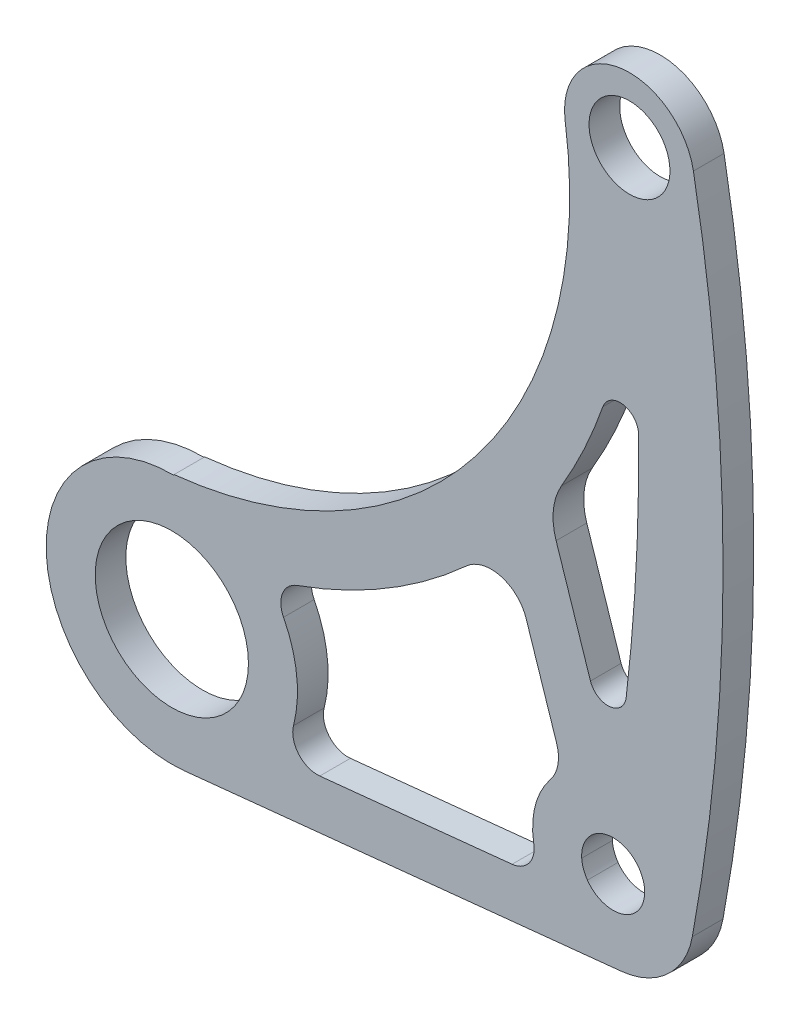
ISO-10303-21;
HEADER;
FILE_DESCRIPTION(('STEP AP214'),'2;1');
FILE_NAME('part.step','',(''),(''),'','','');
FILE_SCHEMA(('AUTOMOTIVE_DESIGN { 1 0 10303 214 1 1 1 1 }'));
ENDSEC;
DATA;
#1=APPLICATION_CONTEXT('core data for automotive mechanical design processes');
#2=APPLICATION_PROTOCOL_DEFINITION('international standard','automotive_design',2000,#1);
#3=PRODUCT_CONTEXT('',#1,'mechanical');
#4=PRODUCT('Part','Part','',(#3));
#5=PRODUCT_RELATED_PRODUCT_CATEGORY('part','',(#4));
#6=PRODUCT_DEFINITION_FORMATION('','',#4);
#7=PRODUCT_DEFINITION_CONTEXT('part definition',#1,'design');
#8=PRODUCT_DEFINITION('design','',#6,#7);
#9=PRODUCT_DEFINITION_SHAPE('','',#8);
#10=(LENGTH_UNIT() NAMED_UNIT(*) SI_UNIT(.MILLI.,.METRE.));
#11=(NAMED_UNIT(*) PLANE_ANGLE_UNIT() SI_UNIT($,.RADIAN.));
#12=(NAMED_UNIT(*) SI_UNIT($,.STERADIAN.) SOLID_ANGLE_UNIT());
#13=UNCERTAINTY_MEASURE_WITH_UNIT(LENGTH_MEASURE(1.E-05),#10,'distance_accuracy_value','');
#14=(GEOMETRIC_REPRESENTATION_CONTEXT(3) GLOBAL_UNCERTAINTY_ASSIGNED_CONTEXT((#13)) GLOBAL_UNIT_ASSIGNED_CONTEXT((#10,
#11,#12)) REPRESENTATION_CONTEXT('',''));
#15=CARTESIAN_POINT('',(0.,0.,0.));
#16=DIRECTION('',(0.,0.,1.));
#17=DIRECTION('',(1.,0.,0.));
#18=AXIS2_PLACEMENT_3D('',#15,#16,#17);
#19=CARTESIAN_POINT('',(45.72,0.,3.175));
#20=DIRECTION('',(0.,0.,-1.));
#21=DIRECTION('',(-1.,0.,0.));
#22=AXIS2_PLACEMENT_3D('',#19,#20,#21);
#23=CYLINDRICAL_SURFACE('',#22,3.2639);
#24=CARTESIAN_POINT('',(45.72,0.,0.));
#25=DIRECTION('',(0.,0.,1.));
#26=DIRECTION('',(1.,0.,0.));
#27=AXIS2_PLACEMENT_3D('',#24,#25,#26);
#28=CIRCLE('',#27,3.2639);
#29=CARTESIAN_POINT('',(42.4625763798194,-0.205510507492002,0.));
#30=VERTEX_POINT('',#29);
#31=CARTESIAN_POINT('',(43.0519360241002,-1.88002069948861,0.));
#32=VERTEX_POINT('',#31);
#33=EDGE_CURVE('E416',#30,#32,#28,.T.);
#34=ORIENTED_EDGE('',*,*,#33,.F.);
#35=DIRECTION('',(0.,0.,1.));
#36=VECTOR('',#35,1.);
#37=CARTESIAN_POINT('',(42.4625763798194,-0.205510507492002,3.175));
#38=LINE('',#37,#36);
#39=CARTESIAN_POINT('',(42.4625763798194,-0.205510507492002,3.175));
#40=VERTEX_POINT('',#39);
#41=EDGE_CURVE('E265',#30,#40,#38,.T.);
#42=ORIENTED_EDGE('',*,*,#41,.T.);
#43=CARTESIAN_POINT('',(45.72,0.,3.175));
#44=DIRECTION('',(0.,0.,1.));
#45=DIRECTION('',(1.,0.,0.));
#46=AXIS2_PLACEMENT_3D('',#43,#44,#45);
#47=CIRCLE('',#46,3.2639);
#48=CARTESIAN_POINT('',(43.0519360241002,-1.88002069948861,3.175));
#49=VERTEX_POINT('',#48);
#50=EDGE_CURVE('E444',#40,#49,#47,.T.);
#51=ORIENTED_EDGE('',*,*,#50,.T.);
#52=DIRECTION('',(0.,0.,1.));
#53=VECTOR('',#52,1.);
#54=CARTESIAN_POINT('',(43.0519360241002,-1.88002069948861,3.175));
#55=LINE('',#54,#53);
#56=EDGE_CURVE('E249',#32,#49,#55,.T.);
#57=ORIENTED_EDGE('',*,*,#56,.F.);
#58=EDGE_LOOP('',(#34,#42,#51,#57));
#59=FACE_BOUND('',#58,.T.);
#60=ADVANCED_FACE('F47',(#59),#23,.F.);
#61=CARTESIAN_POINT('',(48.9774236201806,0.205510507492002,3.175));
#62=VERTEX_POINT('',#61);
#63=EDGE_CURVE('E438',#49,#62,#47,.T.);
#64=ORIENTED_EDGE('',*,*,#63,.T.);
#65=DIRECTION('',(0.,0.,-1.));
#66=VECTOR('',#65,1.);
#67=CARTESIAN_POINT('',(48.9774236201806,0.205510507492002,3.175));
#68=LINE('',#67,#66);
#69=CARTESIAN_POINT('',(48.9774236201806,0.205510507492002,0.));
#70=VERTEX_POINT('',#69);
#71=EDGE_CURVE('E262',#62,#70,#68,.T.);
#72=ORIENTED_EDGE('',*,*,#71,.T.);
#73=EDGE_CURVE('E417',#32,#70,#28,.T.);
#74=ORIENTED_EDGE('',*,*,#73,.F.);
#75=ORIENTED_EDGE('',*,*,#56,.T.);
#76=EDGE_LOOP('',(#64,#72,#74,#75));
#77=FACE_BOUND('',#76,.T.);
#78=ADVANCED_FACE('F503',(#77),#23,.F.);
#79=ORIENTED_EDGE('',*,*,#71,.F.);
#80=CARTESIAN_POINT('',(48.3880639758998,1.88002069948861,3.175));
#81=VERTEX_POINT('',#80);
#82=EDGE_CURVE('E442',#62,#81,#47,.T.);
#83=ORIENTED_EDGE('',*,*,#82,.T.);
#84=DIRECTION('',(0.,0.,-1.));
#85=VECTOR('',#84,1.);
#86=CARTESIAN_POINT('',(48.3880639758998,1.88002069948861,3.175));
#87=LINE('',#86,#85);
#88=CARTESIAN_POINT('',(48.3880639758998,1.88002069948861,0.));
#89=VERTEX_POINT('',#88);
#90=EDGE_CURVE('E253',#81,#89,#87,.T.);
#91=ORIENTED_EDGE('',*,*,#90,.T.);
#92=EDGE_CURVE('E419',#70,#89,#28,.T.);
#93=ORIENTED_EDGE('',*,*,#92,.F.);
#94=EDGE_LOOP('',(#79,#83,#91,#93));
#95=FACE_BOUND('',#94,.T.);
#96=ADVANCED_FACE('F493',(#95),#23,.F.);
#97=CARTESIAN_POINT('',(-142.138533342949,38.656045003802,3.175));
#98=DIRECTION('',(0.,0.,-1.));
#99=DIRECTION('',(-1.,0.,0.));
#100=AXIS2_PLACEMENT_3D('',#97,#98,#99);
#101=CYLINDRICAL_SURFACE('',#100,190.5);
#102=CARTESIAN_POINT('',(-142.138533342949,38.656045003802,0.));
#103=DIRECTION('',(0.,0.,1.));
#104=DIRECTION('',(1.,0.,0.));
#105=AXIS2_PLACEMENT_3D('',#102,#103,#104);
#106=CIRCLE('',#105,190.5);
#107=CARTESIAN_POINT('',(47.0702030784157,16.5132343910918,0.));
#108=VERTEX_POINT('',#107);
#109=CARTESIAN_POINT('',(48.3497321227549,40.7704526909221,0.));
#110=VERTEX_POINT('',#109);
#111=EDGE_CURVE('E356',#108,#110,#106,.T.);
#112=ORIENTED_EDGE('',*,*,#111,.F.);
#113=DIRECTION('',(0.,0.,-1.));
#114=VECTOR('',#113,1.);
#115=CARTESIAN_POINT('',(47.0702030784158,16.5132343910918,3.175));
#116=LINE('',#115,#114);
#117=CARTESIAN_POINT('',(47.0702030784157,16.5132343910918,3.175));
#118=VERTEX_POINT('',#117);
#119=EDGE_CURVE('E321',#108,#118,#116,.F.);
#120=ORIENTED_EDGE('',*,*,#119,.T.);
#121=CARTESIAN_POINT('',(-142.138533342949,38.656045003802,3.175));
#122=DIRECTION('',(0.,0.,1.));
#123=DIRECTION('',(1.,0.,0.));
#124=AXIS2_PLACEMENT_3D('',#121,#122,#123);
#125=CIRCLE('',#124,190.5);
#126=CARTESIAN_POINT('',(48.3497321227549,40.7704526909221,3.175));
#127=VERTEX_POINT('',#126);
#128=EDGE_CURVE('E436',#118,#127,#125,.T.);
#129=ORIENTED_EDGE('',*,*,#128,.T.);
#130=DIRECTION('',(0.,0.,-1.));
#131=VECTOR('',#130,1.);
#132=CARTESIAN_POINT('',(48.3497321227549,40.7704526909221,3.175));
#133=LINE('',#132,#131);
#134=EDGE_CURVE('E318',#127,#110,#133,.T.);
#135=ORIENTED_EDGE('',*,*,#134,.T.);
#136=EDGE_LOOP('',(#112,#120,#129,#135));
#137=FACE_BOUND('',#136,.T.);
#138=ADVANCED_FACE('F425',(#137),#101,.F.);
#139=CARTESIAN_POINT('',(43.9242602583384,14.4500573911322,3.175));
#140=DIRECTION('',(0.949917524329056,0.312500715155273,0.));
#141=DIRECTION('',(-0.312500715155273,0.949917524329056,0.));
#142=AXIS2_PLACEMENT_3D('',#139,#140,#141);
#143=PLANE('',#142);
#144=DIRECTION('',(0.312500715155273,-0.949917524329056,0.));
#145=VECTOR('',#144,1.);
#146=CARTESIAN_POINT('',(43.9242602583384,14.4500573911322,0.));
#147=LINE('',#146,#145);
#148=CARTESIAN_POINT('',(39.8116959434713,26.9511389028385,0.));
#149=VERTEX_POINT('',#148);
#150=CARTESIAN_POINT('',(43.3685228303553,16.1393486348481,0.));
#151=VERTEX_POINT('',#150);
#152=EDGE_CURVE('E352',#149,#151,#147,.T.);
#153=ORIENTED_EDGE('',*,*,#152,.F.);
#154=DIRECTION('',(0.,0.,-1.));
#155=VECTOR('',#154,1.);
#156=CARTESIAN_POINT('',(39.8116959434713,26.9511389028385,3.175));
#157=LINE('',#156,#155);
#158=CARTESIAN_POINT('',(39.8116959434713,26.9511389028385,3.175));
#159=VERTEX_POINT('',#158);
#160=EDGE_CURVE('E68',#149,#159,#157,.F.);
#161=ORIENTED_EDGE('',*,*,#160,.T.);
#162=DIRECTION('',(0.312500715155273,-0.949917524329056,0.));
#163=VECTOR('',#162,1.);
#164=CARTESIAN_POINT('',(43.9242602583384,14.4500573911322,3.175));
#165=LINE('',#164,#163);
#166=CARTESIAN_POINT('',(43.3685228303553,16.1393486348481,3.175));
#167=VERTEX_POINT('',#166);
#168=EDGE_CURVE('E435',#159,#167,#165,.T.);
#169=ORIENTED_EDGE('',*,*,#168,.T.);
#170=DIRECTION('',(0.,0.,1.));
#171=VECTOR('',#170,1.);
#172=CARTESIAN_POINT('',(43.3685228303553,16.1393486348481,0.));
#173=LINE('',#172,#171);
#174=EDGE_CURVE('E315',#167,#151,#173,.F.);
#175=ORIENTED_EDGE('',*,*,#174,.T.);
#176=EDGE_LOOP('',(#153,#161,#169,#175));
#177=FACE_BOUND('',#176,.T.);
#178=ADVANCED_FACE('F543',(#177),#143,.T.);
#179=CARTESIAN_POINT('',(0.811388888888889,-7.89592010604133,3.175));
#180=DIRECTION('',(-0.102222222222222,0.994761588162687,0.));
#181=DIRECTION('',(-0.994761588162687,-0.102222222222222,0.));
#182=AXIS2_PLACEMENT_3D('',#179,#180,#181);
#183=PLANE('',#182);
#184=DIRECTION('',(0.994761588162687,0.102222222222222,0.));
#185=VECTOR('',#184,1.);
#186=CARTESIAN_POINT('',(0.811388888888889,-7.89592010604133,0.));
#187=LINE('',#186,#185);
#188=CARTESIAN_POINT('',(15.3261433532772,-6.40437632910465,0.));
#189=VERTEX_POINT('',#188);
#190=CARTESIAN_POINT('',(35.2507315842154,-4.35691519865322,0.));
#191=VERTEX_POINT('',#190);
#192=EDGE_CURVE('E402',#189,#191,#187,.T.);
#193=ORIENTED_EDGE('',*,*,#192,.F.);
#194=DIRECTION('',(0.,0.,-1.));
#195=VECTOR('',#194,1.);
#196=CARTESIAN_POINT('',(15.3261433532772,-6.40437632910465,3.175));
#197=LINE('',#196,#195);
#198=CARTESIAN_POINT('',(15.3261433532772,-6.40437632910465,3.175));
#199=VERTEX_POINT('',#198);
#200=EDGE_CURVE('E276',#189,#199,#197,.F.);
#201=ORIENTED_EDGE('',*,*,#200,.T.);
#202=DIRECTION('',(0.994761588162687,0.102222222222222,0.));
#203=VECTOR('',#202,1.);
#204=CARTESIAN_POINT('',(0.811388888888889,-7.89592010604133,3.175));
#205=LINE('',#204,#203);
#206=CARTESIAN_POINT('',(35.2507315842154,-4.35691519865322,3.175));
#207=VERTEX_POINT('',#206);
#208=EDGE_CURVE('E473',#199,#207,#205,.T.);
#209=ORIENTED_EDGE('',*,*,#208,.T.);
#210=DIRECTION('',(0.,0.,-1.));
#211=VECTOR('',#210,1.);
#212=CARTESIAN_POINT('',(35.2507315842154,-4.35691519865322,3.175));
#213=LINE('',#212,#211);
#214=EDGE_CURVE('E273',#207,#191,#213,.T.);
#215=ORIENTED_EDGE('',*,*,#214,.T.);
#216=EDGE_LOOP('',(#193,#201,#209,#215));
#217=FACE_BOUND('',#216,.T.);
#218=ADVANCED_FACE('F549',(#217),#183,.T.);
#219=CARTESIAN_POINT('',(0.,0.,3.175));
#220=DIRECTION('',(0.,0.,-1.));
#221=DIRECTION('',(-1.,0.,0.));
#222=AXIS2_PLACEMENT_3D('',#219,#220,#221);
#223=CYLINDRICAL_SURFACE('',#222,13.0175);
#224=CARTESIAN_POINT('',(0.,0.,3.175));
#225=DIRECTION('',(0.,0.,1.));
#226=DIRECTION('',(1.,0.,0.));
#227=AXIS2_PLACEMENT_3D('',#224,#225,#226);
#228=CIRCLE('',#227,13.0175);
#229=CARTESIAN_POINT('',(12.6066623522887,-3.24459097351078,3.175));
#230=VERTEX_POINT('',#229);
#231=CARTESIAN_POINT('',(11.5722495603721,5.9614047306376,3.175));
#232=VERTEX_POINT('',#231);
#233=EDGE_CURVE('E476',#230,#232,#228,.T.);
#234=ORIENTED_EDGE('',*,*,#233,.F.);
#235=DIRECTION('',(0.,0.,-1.));
#236=VECTOR('',#235,1.);
#237=CARTESIAN_POINT('',(12.6066623522887,-3.24459097351078,3.175));
#238=LINE('',#237,#236);
#239=CARTESIAN_POINT('',(12.6066623522887,-3.24459097351078,0.));
#240=VERTEX_POINT('',#239);
#241=EDGE_CURVE('E270',#230,#240,#238,.T.);
#242=ORIENTED_EDGE('',*,*,#241,.T.);
#243=CARTESIAN_POINT('',(0.,0.,0.));
#244=DIRECTION('',(0.,0.,1.));
#245=DIRECTION('',(1.,0.,0.));
#246=AXIS2_PLACEMENT_3D('',#243,#244,#245);
#247=CIRCLE('',#246,13.0175);
#248=CARTESIAN_POINT('',(11.5722495603721,5.9614047306376,0.));
#249=VERTEX_POINT('',#248);
#250=EDGE_CURVE('E405',#240,#249,#247,.T.);
#251=ORIENTED_EDGE('',*,*,#250,.T.);
#252=DIRECTION('',(0.,0.,-1.));
#253=VECTOR('',#252,1.);
#254=CARTESIAN_POINT('',(11.5722495603721,5.9614047306376,3.175));
#255=LINE('',#254,#253);
#256=EDGE_CURVE('E268',#249,#232,#255,.F.);
#257=ORIENTED_EDGE('',*,*,#256,.T.);
#258=EDGE_LOOP('',(#234,#242,#251,#257));
#259=FACE_BOUND('',#258,.T.);
#260=ADVANCED_FACE('F807',(#259),#223,.T.);
#261=CARTESIAN_POINT('',(-4.50533240745612,58.5644592406378,3.175));
#262=DIRECTION('',(0.,0.,-1.));
#263=DIRECTION('',(-1.,0.,0.));
#264=AXIS2_PLACEMENT_3D('',#261,#262,#263);
#265=CYLINDRICAL_SURFACE('',#264,52.07);
#266=CARTESIAN_POINT('',(-4.50533240745612,58.5644592406378,0.));
#267=DIRECTION('',(0.,0.,1.));
#268=DIRECTION('',(1.,0.,0.));
#269=AXIS2_PLACEMENT_3D('',#266,#267,#268);
#270=CIRCLE('',#269,52.07);
#271=CARTESIAN_POINT('',(12.9774317126353,9.51715698331437,0.));
#272=VERTEX_POINT('',#271);
#273=CARTESIAN_POINT('',(30.5233562094004,20.0381581752188,0.));
#274=VERTEX_POINT('',#273);
#275=EDGE_CURVE('E408',#272,#274,#270,.T.);
#276=ORIENTED_EDGE('',*,*,#275,.T.);
#277=DIRECTION('',(0.,0.,-1.));
#278=VECTOR('',#277,1.);
#279=CARTESIAN_POINT('',(30.5233562094004,20.0381581752188,3.175));
#280=LINE('',#279,#278);
#281=CARTESIAN_POINT('',(30.5233562094004,20.0381581752188,3.175));
#282=VERTEX_POINT('',#281);
#283=EDGE_CURVE('E305',#274,#282,#280,.F.);
#284=ORIENTED_EDGE('',*,*,#283,.T.);
#285=CARTESIAN_POINT('',(-4.50533240745612,58.5644592406378,3.175));
#286=DIRECTION('',(0.,0.,1.));
#287=DIRECTION('',(1.,0.,0.));
#288=AXIS2_PLACEMENT_3D('',#285,#286,#287);
#289=CIRCLE('',#288,52.07);
#290=CARTESIAN_POINT('',(12.9774317126353,9.51715698331437,3.175));
#291=VERTEX_POINT('',#290);
#292=EDGE_CURVE('E479',#291,#282,#289,.T.);
#293=ORIENTED_EDGE('',*,*,#292,.F.);
#294=DIRECTION('',(0.,0.,-1.));
#295=VECTOR('',#294,1.);
#296=CARTESIAN_POINT('',(12.9774317126353,9.51715698331437,3.175));
#297=LINE('',#296,#295);
#298=EDGE_CURVE('E281',#291,#272,#297,.T.);
#299=ORIENTED_EDGE('',*,*,#298,.T.);
#300=EDGE_LOOP('',(#276,#284,#293,#299));
#301=FACE_BOUND('',#300,.T.);
#302=ADVANCED_FACE('F815',(#301),#265,.T.);
#303=CARTESIAN_POINT('',(38.586011370491,12.6938979852854,3.175));
#304=DIRECTION('',(0.949917524329056,0.312500715155272,0.));
#305=DIRECTION('',(-0.312500715155272,0.949917524329057,0.));
#306=AXIS2_PLACEMENT_3D('',#303,#304,#305);
#307=PLANE('',#306);
#308=DIRECTION('',(0.312500715155272,-0.949917524329057,0.));
#309=VECTOR('',#308,1.);
#310=CARTESIAN_POINT('',(38.586011370491,12.6938979852854,0.));
#311=LINE('',#310,#309);
#312=CARTESIAN_POINT('',(36.7056167539373,18.4097882610273,0.));
#313=VERTEX_POINT('',#312);
#314=CARTESIAN_POINT('',(39.8655919363517,8.80431967600672,0.));
#315=VERTEX_POINT('',#314);
#316=EDGE_CURVE('E411',#313,#315,#311,.T.);
#317=ORIENTED_EDGE('',*,*,#316,.T.);
#318=DIRECTION('',(0.,0.,1.));
#319=VECTOR('',#318,1.);
#320=CARTESIAN_POINT('',(39.8655919363517,8.80431967600672,3.175));
#321=LINE('',#320,#319);
#322=CARTESIAN_POINT('',(39.8655919363517,8.80431967600672,3.175));
#323=VERTEX_POINT('',#322);
#324=EDGE_CURVE('E303',#315,#323,#321,.T.);
#325=ORIENTED_EDGE('',*,*,#324,.T.);
#326=DIRECTION('',(0.312500715155272,-0.949917524329057,0.));
#327=VECTOR('',#326,1.);
#328=CARTESIAN_POINT('',(38.586011370491,12.6938979852854,3.175));
#329=LINE('',#328,#327);
#330=CARTESIAN_POINT('',(36.7056167539373,18.4097882610273,3.175));
#331=VERTEX_POINT('',#330);
#332=EDGE_CURVE('E482',#331,#323,#329,.T.);
#333=ORIENTED_EDGE('',*,*,#332,.F.);
#334=DIRECTION('',(0.,0.,1.));
#335=VECTOR('',#334,1.);
#336=CARTESIAN_POINT('',(36.7056167539373,18.4097882610273,0.));
#337=LINE('',#336,#335);
#338=EDGE_CURVE('E300',#331,#313,#337,.F.);
#339=ORIENTED_EDGE('',*,*,#338,.T.);
#340=EDGE_LOOP('',(#317,#325,#333,#339));
#341=FACE_BOUND('',#340,.T.);
#342=ADVANCED_FACE('F580',(#341),#307,.F.);
#343=CARTESIAN_POINT('',(45.72,0.,3.175));
#344=DIRECTION('',(0.,0.,-1.));
#345=DIRECTION('',(-1.,0.,0.));
#346=AXIS2_PLACEMENT_3D('',#343,#344,#345);
#347=CYLINDRICAL_SURFACE('',#346,8.3439);
#348=CARTESIAN_POINT('',(45.72,0.,0.));
#349=DIRECTION('',(0.,0.,1.));
#350=DIRECTION('',(1.,0.,0.));
#351=AXIS2_PLACEMENT_3D('',#348,#349,#350);
#352=CIRCLE('',#351,8.3439);
#353=CARTESIAN_POINT('',(46.572932,-8.30019121547064,0.));
#354=VERTEX_POINT('',#353);
#355=CARTESIAN_POINT('',(53.9245222927567,-1.51871036002841,0.));
#356=VERTEX_POINT('',#355);
#357=EDGE_CURVE('E248',#354,#356,#352,.T.);
#358=ORIENTED_EDGE('',*,*,#357,.T.);
#359=DIRECTION('',(0.,0.,-1.));
#360=VECTOR('',#359,1.);
#361=CARTESIAN_POINT('',(53.9245222927567,-1.51871036002841,3.175));
#362=LINE('',#361,#360);
#363=CARTESIAN_POINT('',(53.9245222927567,-1.51871036002841,3.175));
#364=VERTEX_POINT('',#363);
#365=EDGE_CURVE('E228',#364,#356,#362,.T.);
#366=ORIENTED_EDGE('',*,*,#365,.F.);
#367=CARTESIAN_POINT('',(45.72,0.,3.175));
#368=DIRECTION('',(0.,0.,1.));
#369=DIRECTION('',(1.,0.,0.));
#370=AXIS2_PLACEMENT_3D('',#367,#368,#369);
#371=CIRCLE('',#370,8.3439);
#372=CARTESIAN_POINT('',(46.572932,-8.30019121547064,3.175));
#373=VERTEX_POINT('',#372);
#374=EDGE_CURVE('E235',#373,#364,#371,.T.);
#375=ORIENTED_EDGE('',*,*,#374,.F.);
#376=DIRECTION('',(0.,0.,-1.));
#377=VECTOR('',#376,1.);
#378=CARTESIAN_POINT('',(46.572932,-8.30019121547064,3.175));
#379=LINE('',#378,#377);
#380=EDGE_CURVE('E362',#373,#354,#379,.T.);
#381=ORIENTED_EDGE('',*,*,#380,.T.);
#382=EDGE_LOOP('',(#358,#366,#375,#381));
#383=FACE_BOUND('',#382,.T.);
#384=ADVANCED_FACE('F246',(#383),#347,.T.);
#385=CARTESIAN_POINT('',(-133.393338272466,33.1550421520357,3.175));
#386=DIRECTION('',(0.,0.,-1.));
#387=DIRECTION('',(-1.,0.,0.));
#388=AXIS2_PLACEMENT_3D('',#385,#386,#387);
#389=CYLINDRICAL_SURFACE('',#388,190.5);
#390=CARTESIAN_POINT('',(-133.393338272466,33.1550421520357,0.));
#391=DIRECTION('',(0.,0.,1.));
#392=DIRECTION('',(1.,0.,0.));
#393=AXIS2_PLACEMENT_3D('',#390,#391,#392);
#394=CIRCLE('',#393,190.5);
#395=CARTESIAN_POINT('',(54.0358306347205,67.2219857008992,0.));
#396=VERTEX_POINT('',#395);
#397=EDGE_CURVE('E386',#356,#396,#394,.T.);
#398=ORIENTED_EDGE('',*,*,#397,.T.);
#399=DIRECTION('',(0.,0.,-1.));
#400=VECTOR('',#399,1.);
#401=CARTESIAN_POINT('',(54.0358306347205,67.2219857008992,3.175));
#402=LINE('',#401,#400);
#403=CARTESIAN_POINT('',(54.0358306347205,67.2219857008992,3.175));
#404=VERTEX_POINT('',#403);
#405=EDGE_CURVE('E231',#404,#396,#402,.T.);
#406=ORIENTED_EDGE('',*,*,#405,.F.);
#407=CARTESIAN_POINT('',(-133.393338272466,33.1550421520357,3.175));
#408=DIRECTION('',(0.,0.,1.));
#409=DIRECTION('',(1.,0.,0.));
#410=AXIS2_PLACEMENT_3D('',#407,#408,#409);
#411=CIRCLE('',#410,190.5);
#412=EDGE_CURVE('E224',#364,#404,#411,.T.);
#413=ORIENTED_EDGE('',*,*,#412,.F.);
#414=ORIENTED_EDGE('',*,*,#365,.T.);
#415=EDGE_LOOP('',(#398,#406,#413,#414));
#416=FACE_BOUND('',#415,.T.);
#417=ADVANCED_FACE('F226',(#416),#389,.T.);
#418=CARTESIAN_POINT('',(47.4133333333333,66.0182870288394,3.175));
#419=DIRECTION('',(0.,0.,-1.));
#420=DIRECTION('',(-1.,0.,0.));
#421=AXIS2_PLACEMENT_3D('',#418,#419,#420);
#422=CYLINDRICAL_SURFACE('',#421,6.73099999999993);
#423=CARTESIAN_POINT('',(47.4133333333333,66.0182870288394,0.));
#424=DIRECTION('',(0.,0.,1.));
#425=DIRECTION('',(1.,0.,0.));
#426=AXIS2_PLACEMENT_3D('',#423,#424,#425);
#427=CIRCLE('',#426,6.73099999999993);
#428=CARTESIAN_POINT('',(40.7506474150239,65.0617425427021,0.));
#429=VERTEX_POINT('',#428);
#430=EDGE_CURVE('E383',#396,#429,#427,.T.);
#431=ORIENTED_EDGE('',*,*,#430,.T.);
#432=DIRECTION('',(0.,0.,-1.));
#433=VECTOR('',#432,1.);
#434=CARTESIAN_POINT('',(40.7506474150239,65.0617425427021,3.175));
#435=LINE('',#434,#433);
#436=CARTESIAN_POINT('',(40.7506474150239,65.0617425427021,3.175));
#437=VERTEX_POINT('',#436);
#438=EDGE_CURVE('E255',#437,#429,#435,.T.);
#439=ORIENTED_EDGE('',*,*,#438,.F.);
#440=CARTESIAN_POINT('',(47.4133333333333,66.0182870288394,3.175));
#441=DIRECTION('',(0.,0.,1.));
#442=DIRECTION('',(1.,0.,0.));
#443=AXIS2_PLACEMENT_3D('',#440,#441,#442);
#444=CIRCLE('',#443,6.73099999999993);
#445=EDGE_CURVE('E234',#404,#437,#444,.T.);
#446=ORIENTED_EDGE('',*,*,#445,.F.);
#447=ORIENTED_EDGE('',*,*,#405,.T.);
#448=EDGE_LOOP('',(#431,#439,#446,#447));
#449=FACE_BOUND('',#448,.T.);
#450=ADVANCED_FACE('F384',(#449),#422,.T.);
#451=CARTESIAN_POINT('',(-4.50533240745612,58.5644592406378,3.175));
#452=DIRECTION('',(0.,0.,-1.));
#453=DIRECTION('',(-1.,0.,0.));
#454=AXIS2_PLACEMENT_3D('',#451,#452,#453);
#455=CYLINDRICAL_SURFACE('',#454,45.72);
#456=CARTESIAN_POINT('',(-4.50533240745612,58.5644592406378,0.));
#457=DIRECTION('',(0.,0.,1.));
#458=DIRECTION('',(1.,0.,0.));
#459=AXIS2_PLACEMENT_3D('',#456,#457,#458);
#460=CIRCLE('',#459,45.72);
#461=CARTESIAN_POINT('',(0.230104831543752,13.0903563450831,0.));
#462=VERTEX_POINT('',#461);
#463=EDGE_CURVE('E377',#462,#429,#460,.T.);
#464=ORIENTED_EDGE('',*,*,#463,.F.);
#465=DIRECTION('',(0.,0.,-1.));
#466=VECTOR('',#465,1.);
#467=CARTESIAN_POINT('',(0.230104831543752,13.0903563450831,3.175));
#468=LINE('',#467,#466);
#469=CARTESIAN_POINT('',(0.230104831543752,13.0903563450831,3.175));
#470=VERTEX_POINT('',#469);
#471=EDGE_CURVE('E369',#470,#462,#468,.T.);
#472=ORIENTED_EDGE('',*,*,#471,.F.);
#473=CARTESIAN_POINT('',(-4.50533240745612,58.5644592406378,3.175));
#474=DIRECTION('',(0.,0.,1.));
#475=DIRECTION('',(1.,0.,0.));
#476=AXIS2_PLACEMENT_3D('',#473,#474,#475);
#477=CIRCLE('',#476,45.72);
#478=EDGE_CURVE('E380',#470,#437,#477,.T.);
#479=ORIENTED_EDGE('',*,*,#478,.T.);
#480=ORIENTED_EDGE('',*,*,#438,.T.);
#481=EDGE_LOOP('',(#464,#472,#479,#480));
#482=FACE_BOUND('',#481,.T.);
#483=ADVANCED_FACE('F375',(#482),#455,.F.);
#484=CARTESIAN_POINT('',(-6.2268221741051,4.92245790861365,3.175));
#485=DIRECTION('',(-0.784481533745524,0.620152177463137,0.));
#486=DIRECTION('',(-0.620152177463137,-0.784481533745524,0.));
#487=AXIS2_PLACEMENT_3D('',#484,#485,#486);
#488=PLANE('',#487);
#489=DIRECTION('',(0.620152177463137,0.784481533745524,0.));
#490=VECTOR('',#489,1.);
#491=CARTESIAN_POINT('',(-6.2268221741051,4.92245790861365,0.));
#492=LINE('',#491,#490);
#493=CARTESIAN_POINT('',(0.171615761059916,13.0163687056166,0.));
#494=VERTEX_POINT('',#493);
#495=EDGE_CURVE('E391',#494,#462,#492,.T.);
#496=ORIENTED_EDGE('',*,*,#495,.F.);
#497=DIRECTION('',(0.,0.,-1.));
#498=VECTOR('',#497,1.);
#499=CARTESIAN_POINT('',(0.171615761059916,13.0163687056166,3.175));
#500=LINE('',#499,#498);
#501=CARTESIAN_POINT('',(0.171615761059916,13.0163687056166,3.175));
#502=VERTEX_POINT('',#501);
#503=EDGE_CURVE('E367',#502,#494,#500,.T.);
#504=ORIENTED_EDGE('',*,*,#503,.F.);
#505=DIRECTION('',(0.620152177463137,0.784481533745524,0.));
#506=VECTOR('',#505,1.);
#507=CARTESIAN_POINT('',(-6.2268221741051,4.92245790861365,3.175));
#508=LINE('',#507,#506);
#509=EDGE_CURVE('E465',#502,#470,#508,.T.);
#510=ORIENTED_EDGE('',*,*,#509,.T.);
#511=ORIENTED_EDGE('',*,*,#471,.T.);
#512=EDGE_LOOP('',(#496,#504,#510,#511));
#513=FACE_BOUND('',#512,.T.);
#514=ADVANCED_FACE('F462',(#513),#488,.T.);
#515=CARTESIAN_POINT('',(0.,0.,3.175));
#516=DIRECTION('',(0.,0.,-1.));
#517=DIRECTION('',(-1.,0.,0.));
#518=AXIS2_PLACEMENT_3D('',#515,#516,#517);
#519=CYLINDRICAL_SURFACE('',#518,13.0175);
#520=CARTESIAN_POINT('',(0.,0.,0.));
#521=DIRECTION('',(0.,0.,1.));
#522=DIRECTION('',(1.,0.,0.));
#523=AXIS2_PLACEMENT_3D('',#520,#521,#522);
#524=CIRCLE('',#523,13.0175);
#525=CARTESIAN_POINT('',(1.33067777777778,-12.9493089739078,0.));
#526=VERTEX_POINT('',#525);
#527=EDGE_CURVE('E393',#494,#526,#524,.T.);
#528=ORIENTED_EDGE('',*,*,#527,.T.);
#529=DIRECTION('',(0.,0.,-1.));
#530=VECTOR('',#529,1.);
#531=CARTESIAN_POINT('',(1.33067777777778,-12.9493089739078,3.175));
#532=LINE('',#531,#530);
#533=CARTESIAN_POINT('',(1.33067777777778,-12.9493089739078,3.175));
#534=VERTEX_POINT('',#533);
#535=EDGE_CURVE('E364',#534,#526,#532,.T.);
#536=ORIENTED_EDGE('',*,*,#535,.F.);
#537=CARTESIAN_POINT('',(0.,0.,3.175));
#538=DIRECTION('',(0.,0.,1.));
#539=DIRECTION('',(1.,0.,0.));
#540=AXIS2_PLACEMENT_3D('',#537,#538,#539);
#541=CIRCLE('',#540,13.0175);
#542=EDGE_CURVE('E467',#502,#534,#541,.T.);
#543=ORIENTED_EDGE('',*,*,#542,.F.);
#544=ORIENTED_EDGE('',*,*,#503,.T.);
#545=EDGE_LOOP('',(#528,#536,#543,#544));
#546=FACE_BOUND('',#545,.T.);
#547=ADVANCED_FACE('F460',(#546),#519,.T.);
#548=CARTESIAN_POINT('',(47.4133333333333,66.0182870288394,3.175));
#549=DIRECTION('',(0.,0.,-1.));
#550=DIRECTION('',(-1.,0.,0.));
#551=AXIS2_PLACEMENT_3D('',#548,#549,#550);
#552=CYLINDRICAL_SURFACE('',#551,4.1910000000001);
#553=CARTESIAN_POINT('',(47.4133333333333,66.0182870288394,3.175));
#554=DIRECTION('',(0.,0.,1.));
#555=DIRECTION('',(1.,0.,0.));
#556=AXIS2_PLACEMENT_3D('',#553,#554,#555);
#557=CIRCLE('',#556,4.1910000000001);
#558=CARTESIAN_POINT('',(51.6043333333335,66.0182870288394,3.175));
#559=VERTEX_POINT('',#558);
#560=EDGE_CURVE('E449',#559,#559,#557,.T.);
#561=ORIENTED_EDGE('',*,*,#560,.T.);
#562=EDGE_LOOP('',(#561));
#563=FACE_BOUND('',#562,.T.);
#564=CARTESIAN_POINT('',(47.4133333333333,66.0182870288394,0.));
#565=DIRECTION('',(0.,0.,1.));
#566=DIRECTION('',(1.,0.,0.));
#567=AXIS2_PLACEMENT_3D('',#564,#565,#566);
#568=CIRCLE('',#567,4.1910000000001);
#569=CARTESIAN_POINT('',(51.6043333333335,66.0182870288394,0.));
#570=VERTEX_POINT('',#569);
#571=EDGE_CURVE('E351',#570,#570,#568,.T.);
#572=ORIENTED_EDGE('',*,*,#571,.F.);
#573=EDGE_LOOP('',(#572));
#574=FACE_BOUND('',#573,.T.);
#575=ADVANCED_FACE('F538',(#563,#574),#552,.F.);
#576=CARTESIAN_POINT('',(-4.50533240745612,58.5644592406378,3.175));
#577=DIRECTION('',(0.,0.,-1.));
#578=DIRECTION('',(-1.,0.,0.));
#579=AXIS2_PLACEMENT_3D('',#576,#577,#578);
#580=CYLINDRICAL_SURFACE('',#579,52.07);
#581=CARTESIAN_POINT('',(-4.50533240745612,58.5644592406378,3.175));
#582=DIRECTION('',(0.,0.,1.));
#583=DIRECTION('',(1.,0.,0.));
#584=AXIS2_PLACEMENT_3D('',#581,#582,#583);
#585=CIRCLE('',#584,52.07);
#586=CARTESIAN_POINT('',(40.3709543283503,32.1560554871792,3.175));
#587=VERTEX_POINT('',#586);
#588=CARTESIAN_POINT('',(44.646607754843,41.3780786361658,3.175));
#589=VERTEX_POINT('',#588);
#590=EDGE_CURVE('E344',#587,#589,#585,.T.);
#591=ORIENTED_EDGE('',*,*,#590,.F.);
#592=DIRECTION('',(0.,0.,-1.));
#593=VECTOR('',#592,1.);
#594=CARTESIAN_POINT('',(40.3709543283503,32.1560554871792,3.175));
#595=LINE('',#594,#593);
#596=CARTESIAN_POINT('',(40.3709543283503,32.1560554871792,0.));
#597=VERTEX_POINT('',#596);
#598=EDGE_CURVE('E336',#587,#597,#595,.T.);
#599=ORIENTED_EDGE('',*,*,#598,.T.);
#600=CARTESIAN_POINT('',(-4.50533240745612,58.5644592406378,0.));
#601=DIRECTION('',(0.,0.,1.));
#602=DIRECTION('',(1.,0.,0.));
#603=AXIS2_PLACEMENT_3D('',#600,#601,#602);
#604=CIRCLE('',#603,52.07);
#605=CARTESIAN_POINT('',(44.646607754843,41.3780786361658,0.));
#606=VERTEX_POINT('',#605);
#607=EDGE_CURVE('E343',#597,#606,#604,.T.);
#608=ORIENTED_EDGE('',*,*,#607,.T.);
#609=DIRECTION('',(0.,0.,-1.));
#610=VECTOR('',#609,1.);
#611=CARTESIAN_POINT('',(44.646607754843,41.3780786361658,3.175));
#612=LINE('',#611,#610);
#613=EDGE_CURVE('E323',#606,#589,#612,.F.);
#614=ORIENTED_EDGE('',*,*,#613,.T.);
#615=EDGE_LOOP('',(#591,#599,#608,#614));
#616=FACE_BOUND('',#615,.T.);
#617=ADVANCED_FACE('F342',(#616),#580,.T.);
#618=ORIENTED_EDGE('',*,*,#41,.F.);
#619=EDGE_CURVE('E420',#89,#30,#28,.T.);
#620=ORIENTED_EDGE('',*,*,#619,.F.);
#621=ORIENTED_EDGE('',*,*,#90,.F.);
#622=EDGE_CURVE('E445',#81,#40,#47,.T.);
#623=ORIENTED_EDGE('',*,*,#622,.T.);
#624=EDGE_LOOP('',(#618,#620,#621,#623));
#625=FACE_BOUND('',#624,.T.);
#626=ADVANCED_FACE('F500',(#625),#23,.F.);
#627=CARTESIAN_POINT('',(45.72,0.,3.175));
#628=DIRECTION('',(0.,0.,-1.));
#629=DIRECTION('',(-1.,0.,0.));
#630=AXIS2_PLACEMENT_3D('',#627,#628,#629);
#631=CYLINDRICAL_SURFACE('',#630,8.3439);
#632=CARTESIAN_POINT('',(45.72,0.,3.175));
#633=DIRECTION('',(0.,0.,1.));
#634=DIRECTION('',(1.,0.,0.));
#635=AXIS2_PLACEMENT_3D('',#632,#633,#634);
#636=CIRCLE('',#635,8.3439);
#637=CARTESIAN_POINT('',(39.2161847991728,5.22695466246729,3.175));
#638=VERTEX_POINT('',#637);
#639=CARTESIAN_POINT('',(37.494917445542,-1.40309806583551,3.175));
#640=VERTEX_POINT('',#639);
#641=EDGE_CURVE('E484',#638,#640,#636,.T.);
#642=ORIENTED_EDGE('',*,*,#641,.F.);
#643=DIRECTION('',(0.,0.,-1.));
#644=VECTOR('',#643,1.);
#645=CARTESIAN_POINT('',(39.2161847991728,5.22695466246729,3.175));
#646=LINE('',#645,#644);
#647=CARTESIAN_POINT('',(39.2161847991728,5.22695466246729,0.));
#648=VERTEX_POINT('',#647);
#649=EDGE_CURVE('E297',#638,#648,#646,.T.);
#650=ORIENTED_EDGE('',*,*,#649,.T.);
#651=CARTESIAN_POINT('',(45.72,0.,0.));
#652=DIRECTION('',(0.,0.,1.));
#653=DIRECTION('',(1.,0.,0.));
#654=AXIS2_PLACEMENT_3D('',#651,#652,#653);
#655=CIRCLE('',#654,8.3439);
#656=CARTESIAN_POINT('',(37.494917445542,-1.40309806583551,0.));
#657=VERTEX_POINT('',#656);
#658=EDGE_CURVE('E414',#648,#657,#655,.T.);
#659=ORIENTED_EDGE('',*,*,#658,.T.);
#660=DIRECTION('',(0.,0.,-1.));
#661=VECTOR('',#660,1.);
#662=CARTESIAN_POINT('',(37.494917445542,-1.40309806583552,3.175));
#663=LINE('',#662,#661);
#664=EDGE_CURVE('E278',#657,#640,#663,.F.);
#665=ORIENTED_EDGE('',*,*,#664,.T.);
#666=EDGE_LOOP('',(#642,#650,#659,#665));
#667=FACE_BOUND('',#666,.T.);
#668=ADVANCED_FACE('F530',(#667),#631,.T.);
#669=CARTESIAN_POINT('',(1.33067777777778,-12.9493089739078,3.175));
#670=DIRECTION('',(0.102222222222222,-0.994761588162687,0.));
#671=DIRECTION('',(0.994761588162687,0.102222222222222,0.));
#672=AXIS2_PLACEMENT_3D('',#669,#670,#671);
#673=PLANE('',#672);
#674=DIRECTION('',(-0.994761588162687,-0.102222222222222,0.));
#675=VECTOR('',#674,1.);
#676=CARTESIAN_POINT('',(1.33067777777778,-12.9493089739078,0.));
#677=LINE('',#676,#675);
#678=EDGE_CURVE('E399',#354,#526,#677,.T.);
#679=ORIENTED_EDGE('',*,*,#678,.F.);
#680=ORIENTED_EDGE('',*,*,#380,.F.);
#681=DIRECTION('',(-0.994761588162687,-0.102222222222222,0.));
#682=VECTOR('',#681,1.);
#683=CARTESIAN_POINT('',(1.33067777777778,-12.9493089739078,3.175));
#684=LINE('',#683,#682);
#685=EDGE_CURVE('E242',#373,#534,#684,.T.);
#686=ORIENTED_EDGE('',*,*,#685,.T.);
#687=ORIENTED_EDGE('',*,*,#535,.T.);
#688=EDGE_LOOP('',(#679,#680,#686,#687));
#689=FACE_BOUND('',#688,.T.);
#690=ADVANCED_FACE('F456',(#689),#673,.T.);
#691=CARTESIAN_POINT('',(0.,0.,3.175));
#692=DIRECTION('',(0.,0.,-1.));
#693=DIRECTION('',(-1.,0.,0.));
#694=AXIS2_PLACEMENT_3D('',#691,#692,#693);
#695=CYLINDRICAL_SURFACE('',#694,7.9375);
#696=CARTESIAN_POINT('',(0.,0.,3.175));
#697=DIRECTION('',(0.,0.,1.));
#698=DIRECTION('',(1.,0.,0.));
#699=AXIS2_PLACEMENT_3D('',#696,#697,#698);
#700=CIRCLE('',#699,7.9375);
#701=CARTESIAN_POINT('',(7.9375,0.,3.175));
#702=VERTEX_POINT('',#701);
#703=EDGE_CURVE('E365',#702,#702,#700,.T.);
#704=ORIENTED_EDGE('',*,*,#703,.T.);
#705=EDGE_LOOP('',(#704));
#706=FACE_BOUND('',#705,.T.);
#707=CARTESIAN_POINT('',(0.,0.,0.));
#708=DIRECTION('',(0.,0.,1.));
#709=DIRECTION('',(1.,0.,0.));
#710=AXIS2_PLACEMENT_3D('',#707,#708,#709);
#711=CIRCLE('',#710,7.9375);
#712=CARTESIAN_POINT('',(7.9375,0.,0.));
#713=VERTEX_POINT('',#712);
#714=EDGE_CURVE('E244',#713,#713,#711,.T.);
#715=ORIENTED_EDGE('',*,*,#714,.F.);
#716=EDGE_LOOP('',(#715));
#717=FACE_BOUND('',#716,.T.);
#718=ADVANCED_FACE('F518',(#706,#717),#695,.F.);
#719=CARTESIAN_POINT('',(0.,0.,3.175));
#720=DIRECTION('',(0.,0.,1.));
#721=DIRECTION('',(1.,0.,0.));
#722=AXIS2_PLACEMENT_3D('',#719,#720,#721);
#723=PLANE('',#722);
#724=ORIENTED_EDGE('',*,*,#374,.T.);
#725=ORIENTED_EDGE('',*,*,#412,.T.);
#726=ORIENTED_EDGE('',*,*,#445,.T.);
#727=ORIENTED_EDGE('',*,*,#478,.F.);
#728=ORIENTED_EDGE('',*,*,#509,.F.);
#729=ORIENTED_EDGE('',*,*,#542,.T.);
#730=ORIENTED_EDGE('',*,*,#685,.F.);
#731=EDGE_LOOP('',(#724,#725,#726,#727,#728,#729,#730));
#732=FACE_BOUND('',#731,.T.);
#733=ORIENTED_EDGE('',*,*,#208,.F.);
#734=CARTESIAN_POINT('',(15.0664989088328,-3.87768189517143,3.175));
#735=DIRECTION('',(0.,0.,1.));
#736=DIRECTION('',(1.,0.,0.));
#737=AXIS2_PLACEMENT_3D('',#734,#735,#736);
#738=CIRCLE('',#737,2.54);
#739=EDGE_CURVE('E286',#199,#230,#738,.F.);
#740=ORIENTED_EDGE('',*,*,#739,.T.);
#741=ORIENTED_EDGE('',*,*,#233,.T.);
#742=CARTESIAN_POINT('',(13.830249474591,7.12460565368884,3.175));
#743=DIRECTION('',(0.,0.,1.));
#744=DIRECTION('',(1.,0.,0.));
#745=AXIS2_PLACEMENT_3D('',#742,#743,#744);
#746=CIRCLE('',#745,2.54);
#747=EDGE_CURVE('E295',#232,#291,#746,.F.);
#748=ORIENTED_EDGE('',*,*,#747,.T.);
#749=ORIENTED_EDGE('',*,*,#292,.T.);
#750=CARTESIAN_POINT('',(33.0864309862436,17.2191605362857,3.175));
#751=DIRECTION('',(0.,0.,1.));
#752=DIRECTION('',(1.,0.,0.));
#753=AXIS2_PLACEMENT_3D('',#750,#751,#752);
#754=CIRCLE('',#753,3.81);
#755=EDGE_CURVE('E313',#282,#331,#754,.F.);
#756=ORIENTED_EDGE('',*,*,#755,.T.);
#757=ORIENTED_EDGE('',*,*,#332,.T.);
#758=CARTESIAN_POINT('',(36.246406168658,7.61369195126514,3.175));
#759=DIRECTION('',(0.,0.,1.));
#760=DIRECTION('',(1.,0.,0.));
#761=AXIS2_PLACEMENT_3D('',#758,#759,#760);
#762=CIRCLE('',#761,3.81);
#763=EDGE_CURVE('E309',#323,#638,#762,.F.);
#764=ORIENTED_EDGE('',*,*,#763,.T.);
#765=ORIENTED_EDGE('',*,*,#641,.T.);
#766=CARTESIAN_POINT('',(34.991087139771,-1.83022076472,3.175));
#767=DIRECTION('',(0.,0.,1.));
#768=DIRECTION('',(1.,0.,0.));
#769=AXIS2_PLACEMENT_3D('',#766,#767,#768);
#770=CIRCLE('',#769,2.54);
#771=EDGE_CURVE('E291',#640,#207,#770,.F.);
#772=ORIENTED_EDGE('',*,*,#771,.T.);
#773=EDGE_LOOP('',(#733,#740,#741,#748,#749,#756,#757,#764,#765,#772));
#774=FACE_BOUND('',#773,.T.);
#775=ORIENTED_EDGE('',*,*,#63,.F.);
#776=ORIENTED_EDGE('',*,*,#50,.F.);
#777=ORIENTED_EDGE('',*,*,#622,.F.);
#778=ORIENTED_EDGE('',*,*,#82,.F.);
#779=EDGE_LOOP('',(#775,#776,#777,#778));
#780=FACE_BOUND('',#779,.T.);
#781=ORIENTED_EDGE('',*,*,#128,.F.);
#782=CARTESIAN_POINT('',(45.1781157142021,16.7346624972189,3.175));
#783=DIRECTION('',(0.,0.,1.));
#784=DIRECTION('',(1.,0.,0.));
#785=AXIS2_PLACEMENT_3D('',#782,#783,#784);
#786=CIRCLE('',#785,1.905);
#787=EDGE_CURVE('E328',#118,#167,#786,.F.);
#788=ORIENTED_EDGE('',*,*,#787,.T.);
#789=ORIENTED_EDGE('',*,*,#168,.F.);
#790=CARTESIAN_POINT('',(45.8436722229608,28.9355184440745,3.175));
#791=DIRECTION('',(0.,0.,1.));
#792=DIRECTION('',(1.,0.,0.));
#793=AXIS2_PLACEMENT_3D('',#790,#791,#792);
#794=CIRCLE('',#793,6.35);
#795=EDGE_CURVE('E11',#159,#587,#794,.F.);
#796=ORIENTED_EDGE('',*,*,#795,.T.);
#797=ORIENTED_EDGE('',*,*,#590,.T.);
#798=CARTESIAN_POINT('',(46.4448494680978,40.7493086140509,3.175));
#799=DIRECTION('',(0.,0.,1.));
#800=DIRECTION('',(1.,0.,0.));
#801=AXIS2_PLACEMENT_3D('',#798,#799,#800);
#802=CIRCLE('',#801,1.905);
#803=EDGE_CURVE('E334',#589,#127,#802,.F.);
#804=ORIENTED_EDGE('',*,*,#803,.T.);
#805=EDGE_LOOP('',(#781,#788,#789,#796,#797,#804));
#806=FACE_BOUND('',#805,.T.);
#807=ORIENTED_EDGE('',*,*,#560,.F.);
#808=EDGE_LOOP('',(#807));
#809=FACE_BOUND('',#808,.T.);
#810=ORIENTED_EDGE('',*,*,#703,.F.);
#811=EDGE_LOOP('',(#810));
#812=FACE_BOUND('',#811,.T.);
#813=ADVANCED_FACE('F239',(#732,#774,#780,#806,#809,#812),#723,.T.);
#814=CARTESIAN_POINT('',(0.,0.,0.));
#815=DIRECTION('',(0.,0.,1.));
#816=DIRECTION('',(1.,0.,0.));
#817=AXIS2_PLACEMENT_3D('',#814,#815,#816);
#818=PLANE('',#817);
#819=ORIENTED_EDGE('',*,*,#357,.F.);
#820=ORIENTED_EDGE('',*,*,#678,.T.);
#821=ORIENTED_EDGE('',*,*,#527,.F.);
#822=ORIENTED_EDGE('',*,*,#495,.T.);
#823=ORIENTED_EDGE('',*,*,#463,.T.);
#824=ORIENTED_EDGE('',*,*,#430,.F.);
#825=ORIENTED_EDGE('',*,*,#397,.F.);
#826=EDGE_LOOP('',(#819,#820,#821,#822,#823,#824,#825));
#827=FACE_BOUND('',#826,.T.);
#828=ORIENTED_EDGE('',*,*,#250,.F.);
#829=CARTESIAN_POINT('',(15.0664989088328,-3.87768189517143,0.));
#830=DIRECTION('',(0.,0.,1.));
#831=DIRECTION('',(1.,0.,0.));
#832=AXIS2_PLACEMENT_3D('',#829,#830,#831);
#833=CIRCLE('',#832,2.54);
#834=EDGE_CURVE('E284',#240,#189,#833,.T.);
#835=ORIENTED_EDGE('',*,*,#834,.T.);
#836=ORIENTED_EDGE('',*,*,#192,.T.);
#837=CARTESIAN_POINT('',(34.991087139771,-1.83022076472,0.));
#838=DIRECTION('',(0.,0.,1.));
#839=DIRECTION('',(1.,0.,0.));
#840=AXIS2_PLACEMENT_3D('',#837,#838,#839);
#841=CIRCLE('',#840,2.54);
#842=EDGE_CURVE('E288',#191,#657,#841,.T.);
#843=ORIENTED_EDGE('',*,*,#842,.T.);
#844=ORIENTED_EDGE('',*,*,#658,.F.);
#845=CARTESIAN_POINT('',(36.246406168658,7.61369195126514,0.));
#846=DIRECTION('',(0.,0.,1.));
#847=DIRECTION('',(1.,0.,0.));
#848=AXIS2_PLACEMENT_3D('',#845,#846,#847);
#849=CIRCLE('',#848,3.81);
#850=EDGE_CURVE('E307',#648,#315,#849,.T.);
#851=ORIENTED_EDGE('',*,*,#850,.T.);
#852=ORIENTED_EDGE('',*,*,#316,.F.);
#853=CARTESIAN_POINT('',(33.0864309862436,17.2191605362857,0.));
#854=DIRECTION('',(0.,0.,1.));
#855=DIRECTION('',(1.,0.,0.));
#856=AXIS2_PLACEMENT_3D('',#853,#854,#855);
#857=CIRCLE('',#856,3.81);
#858=EDGE_CURVE('E311',#313,#274,#857,.T.);
#859=ORIENTED_EDGE('',*,*,#858,.T.);
#860=ORIENTED_EDGE('',*,*,#275,.F.);
#861=CARTESIAN_POINT('',(13.830249474591,7.12460565368884,0.));
#862=DIRECTION('',(0.,0.,1.));
#863=DIRECTION('',(1.,0.,0.));
#864=AXIS2_PLACEMENT_3D('',#861,#862,#863);
#865=CIRCLE('',#864,2.54);
#866=EDGE_CURVE('E293',#272,#249,#865,.T.);
#867=ORIENTED_EDGE('',*,*,#866,.T.);
#868=EDGE_LOOP('',(#828,#835,#836,#843,#844,#851,#852,#859,#860,#867));
#869=FACE_BOUND('',#868,.T.);
#870=ORIENTED_EDGE('',*,*,#73,.T.);
#871=ORIENTED_EDGE('',*,*,#92,.T.);
#872=ORIENTED_EDGE('',*,*,#619,.T.);
#873=ORIENTED_EDGE('',*,*,#33,.T.);
#874=EDGE_LOOP('',(#870,#871,#872,#873));
#875=FACE_BOUND('',#874,.T.);
#876=ORIENTED_EDGE('',*,*,#607,.F.);
#877=CARTESIAN_POINT('',(45.8436722229608,28.9355184440745,0.));
#878=DIRECTION('',(0.,0.,1.));
#879=DIRECTION('',(1.,0.,0.));
#880=AXIS2_PLACEMENT_3D('',#877,#878,#879);
#881=CIRCLE('',#880,6.35);
#882=EDGE_CURVE('E55',#597,#149,#881,.T.);
#883=ORIENTED_EDGE('',*,*,#882,.T.);
#884=ORIENTED_EDGE('',*,*,#152,.T.);
#885=CARTESIAN_POINT('',(45.1781157142021,16.7346624972189,0.));
#886=DIRECTION('',(0.,0.,1.));
#887=DIRECTION('',(1.,0.,0.));
#888=AXIS2_PLACEMENT_3D('',#885,#886,#887);
#889=CIRCLE('',#888,1.905);
#890=EDGE_CURVE('E326',#151,#108,#889,.T.);
#891=ORIENTED_EDGE('',*,*,#890,.T.);
#892=ORIENTED_EDGE('',*,*,#111,.T.);
#893=CARTESIAN_POINT('',(46.4448494680978,40.7493086140509,0.));
#894=DIRECTION('',(0.,0.,1.));
#895=DIRECTION('',(1.,0.,0.));
#896=AXIS2_PLACEMENT_3D('',#893,#894,#895);
#897=CIRCLE('',#896,1.905);
#898=EDGE_CURVE('E331',#110,#606,#897,.T.);
#899=ORIENTED_EDGE('',*,*,#898,.T.);
#900=EDGE_LOOP('',(#876,#883,#884,#891,#892,#899));
#901=FACE_BOUND('',#900,.T.);
#902=ORIENTED_EDGE('',*,*,#571,.T.);
#903=EDGE_LOOP('',(#902));
#904=FACE_BOUND('',#903,.T.);
#905=ORIENTED_EDGE('',*,*,#714,.T.);
#906=EDGE_LOOP('',(#905));
#907=FACE_BOUND('',#906,.T.);
#908=ADVANCED_FACE('F347',(#827,#869,#875,#901,#904,#907),#818,.F.);
#909=CARTESIAN_POINT('',(15.0664989088328,-3.87768189517143,3.175));
#910=DIRECTION('',(0.,0.,-1.));
#911=DIRECTION('',(-1.,0.,0.));
#912=AXIS2_PLACEMENT_3D('',#909,#910,#911);
#913=CYLINDRICAL_SURFACE('',#912,2.54);
#914=ORIENTED_EDGE('',*,*,#739,.F.);
#915=ORIENTED_EDGE('',*,*,#200,.F.);
#916=ORIENTED_EDGE('',*,*,#834,.F.);
#917=ORIENTED_EDGE('',*,*,#241,.F.);
#918=EDGE_LOOP('',(#914,#915,#916,#917));
#919=FACE_BOUND('',#918,.T.);
#920=ADVANCED_FACE('F508',(#919),#913,.F.);
#921=CARTESIAN_POINT('',(34.991087139771,-1.83022076472,3.175));
#922=DIRECTION('',(0.,0.,-1.));
#923=DIRECTION('',(-1.,0.,0.));
#924=AXIS2_PLACEMENT_3D('',#921,#922,#923);
#925=CYLINDRICAL_SURFACE('',#924,2.54);
#926=ORIENTED_EDGE('',*,*,#771,.F.);
#927=ORIENTED_EDGE('',*,*,#664,.F.);
#928=ORIENTED_EDGE('',*,*,#842,.F.);
#929=ORIENTED_EDGE('',*,*,#214,.F.);
#930=EDGE_LOOP('',(#926,#927,#928,#929));
#931=FACE_BOUND('',#930,.T.);
#932=ADVANCED_FACE('F515',(#931),#925,.F.);
#933=CARTESIAN_POINT('',(13.830249474591,7.12460565368884,3.175));
#934=DIRECTION('',(0.,0.,1.));
#935=DIRECTION('',(1.,0.,0.));
#936=AXIS2_PLACEMENT_3D('',#933,#934,#935);
#937=CYLINDRICAL_SURFACE('',#936,2.54);
#938=ORIENTED_EDGE('',*,*,#747,.F.);
#939=ORIENTED_EDGE('',*,*,#256,.F.);
#940=ORIENTED_EDGE('',*,*,#866,.F.);
#941=ORIENTED_EDGE('',*,*,#298,.F.);
#942=EDGE_LOOP('',(#938,#939,#940,#941));
#943=FACE_BOUND('',#942,.T.);
#944=ADVANCED_FACE('F584',(#943),#937,.F.);
#945=CARTESIAN_POINT('',(36.246406168658,7.61369195126514,3.175));
#946=DIRECTION('',(0.,0.,-1.));
#947=DIRECTION('',(-1.,0.,0.));
#948=AXIS2_PLACEMENT_3D('',#945,#946,#947);
#949=CYLINDRICAL_SURFACE('',#948,3.81);
#950=ORIENTED_EDGE('',*,*,#763,.F.);
#951=ORIENTED_EDGE('',*,*,#324,.F.);
#952=ORIENTED_EDGE('',*,*,#850,.F.);
#953=ORIENTED_EDGE('',*,*,#649,.F.);
#954=EDGE_LOOP('',(#950,#951,#952,#953));
#955=FACE_BOUND('',#954,.T.);
#956=ADVANCED_FACE('F588',(#955),#949,.F.);
#957=CARTESIAN_POINT('',(33.0864309862436,17.2191605362857,3.175));
#958=DIRECTION('',(0.,0.,-1.));
#959=DIRECTION('',(-1.,0.,0.));
#960=AXIS2_PLACEMENT_3D('',#957,#958,#959);
#961=CYLINDRICAL_SURFACE('',#960,3.81);
#962=ORIENTED_EDGE('',*,*,#755,.F.);
#963=ORIENTED_EDGE('',*,*,#283,.F.);
#964=ORIENTED_EDGE('',*,*,#858,.F.);
#965=ORIENTED_EDGE('',*,*,#338,.F.);
#966=EDGE_LOOP('',(#962,#963,#964,#965));
#967=FACE_BOUND('',#966,.T.);
#968=ADVANCED_FACE('F592',(#967),#961,.F.);
#969=CARTESIAN_POINT('',(45.1781157142021,16.7346624972189,3.175));
#970=DIRECTION('',(0.,0.,-1.));
#971=DIRECTION('',(-1.,0.,0.));
#972=AXIS2_PLACEMENT_3D('',#969,#970,#971);
#973=CYLINDRICAL_SURFACE('',#972,1.905);
#974=ORIENTED_EDGE('',*,*,#787,.F.);
#975=ORIENTED_EDGE('',*,*,#119,.F.);
#976=ORIENTED_EDGE('',*,*,#890,.F.);
#977=ORIENTED_EDGE('',*,*,#174,.F.);
#978=EDGE_LOOP('',(#974,#975,#976,#977));
#979=FACE_BOUND('',#978,.T.);
#980=ADVANCED_FACE('F431',(#979),#973,.F.);
#981=CARTESIAN_POINT('',(46.4448494680978,40.7493086140509,3.175));
#982=DIRECTION('',(0.,0.,-1.));
#983=DIRECTION('',(-1.,0.,0.));
#984=AXIS2_PLACEMENT_3D('',#981,#982,#983);
#985=CYLINDRICAL_SURFACE('',#984,1.905);
#986=ORIENTED_EDGE('',*,*,#803,.F.);
#987=ORIENTED_EDGE('',*,*,#613,.F.);
#988=ORIENTED_EDGE('',*,*,#898,.F.);
#989=ORIENTED_EDGE('',*,*,#134,.F.);
#990=EDGE_LOOP('',(#986,#987,#988,#989));
#991=FACE_BOUND('',#990,.T.);
#992=ADVANCED_FACE('F596',(#991),#985,.F.);
#993=CARTESIAN_POINT('',(45.8436722229608,28.9355184440745,3.175));
#994=DIRECTION('',(0.,0.,-1.));
#995=DIRECTION('',(-1.,0.,0.));
#996=AXIS2_PLACEMENT_3D('',#993,#994,#995);
#997=CYLINDRICAL_SURFACE('',#996,6.35);
#998=ORIENTED_EDGE('',*,*,#795,.F.);
#999=ORIENTED_EDGE('',*,*,#160,.F.);
#1000=ORIENTED_EDGE('',*,*,#882,.F.);
#1001=ORIENTED_EDGE('',*,*,#598,.F.);
#1002=EDGE_LOOP('',(#998,#999,#1000,#1001));
#1003=FACE_BOUND('',#1002,.T.);
#1004=ADVANCED_FACE('F49',(#1003),#997,.F.);
#1005=CLOSED_SHELL('',(#60,#78,#96,#138,#178,#218,#260,#302,#342,#384,#417,#450,#483,#514,#547,
#575,#617,#626,#668,#690,#718,#813,#908,#920,#932,#944,#956,#968,#980,#992,#1004));
#1006=MANIFOLD_SOLID_BREP('B2',#1005);
#1007=ADVANCED_BREP_SHAPE_REPRESENTATION('',(#18,#1006),#14);
#1008=SHAPE_DEFINITION_REPRESENTATION(#9,#1007);
ENDSEC;
END-ISO-10303-21;
